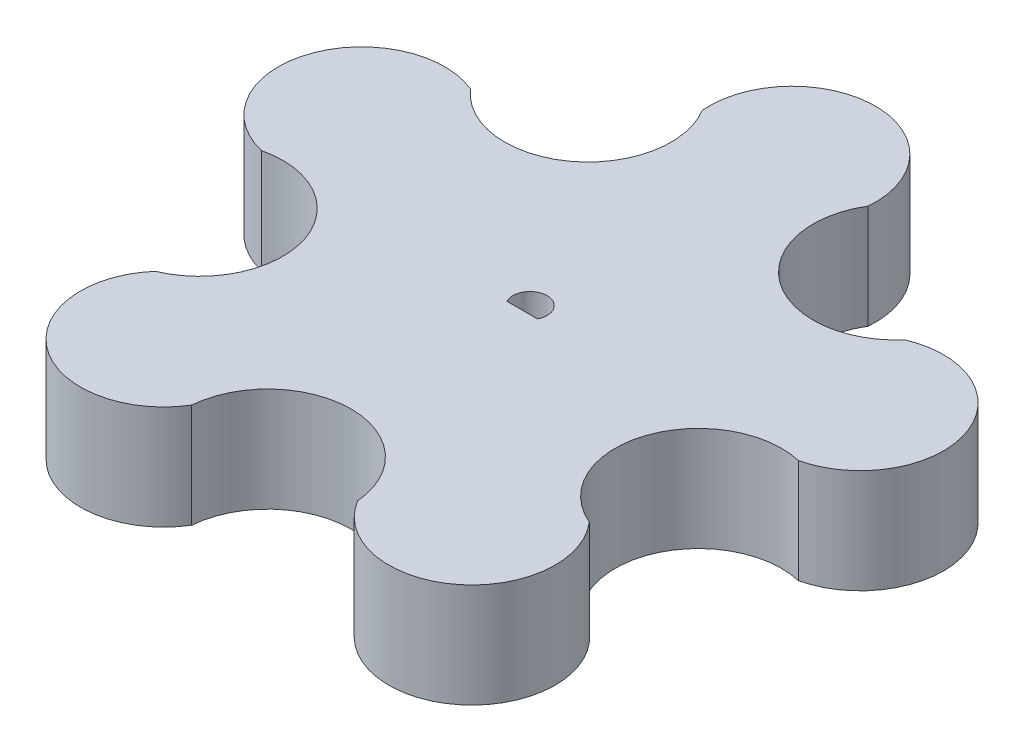
ISO-10303-21;
HEADER;
FILE_DESCRIPTION(('STEP AP214'),'2;1');
FILE_NAME('part.step','',(''),(''),'','','');
FILE_SCHEMA(('AUTOMOTIVE_DESIGN { 1 0 10303 214 1 1 1 1 }'));
ENDSEC;
DATA;
#1=APPLICATION_CONTEXT('core data for automotive mechanical design processes');
#2=APPLICATION_PROTOCOL_DEFINITION('international standard','automotive_design',2000,#1);
#3=PRODUCT_CONTEXT('',#1,'mechanical');
#4=PRODUCT('Part','Part','',(#3));
#5=PRODUCT_RELATED_PRODUCT_CATEGORY('part','',(#4));
#6=PRODUCT_DEFINITION_FORMATION('','',#4);
#7=PRODUCT_DEFINITION_CONTEXT('part definition',#1,'design');
#8=PRODUCT_DEFINITION('design','',#6,#7);
#9=PRODUCT_DEFINITION_SHAPE('','',#8);
#10=(LENGTH_UNIT() NAMED_UNIT(*) SI_UNIT(.MILLI.,.METRE.));
#11=(NAMED_UNIT(*) PLANE_ANGLE_UNIT() SI_UNIT($,.RADIAN.));
#12=(NAMED_UNIT(*) SI_UNIT($,.STERADIAN.) SOLID_ANGLE_UNIT());
#13=UNCERTAINTY_MEASURE_WITH_UNIT(LENGTH_MEASURE(1.E-05),#10,'distance_accuracy_value','');
#14=(GEOMETRIC_REPRESENTATION_CONTEXT(3) GLOBAL_UNCERTAINTY_ASSIGNED_CONTEXT((#13)) GLOBAL_UNIT_ASSIGNED_CONTEXT((#10,
#11,#12)) REPRESENTATION_CONTEXT('',''));
#15=CARTESIAN_POINT('',(0.,0.,0.));
#16=DIRECTION('',(0.,0.,1.));
#17=DIRECTION('',(1.,0.,0.));
#18=AXIS2_PLACEMENT_3D('',#15,#16,#17);
#19=CARTESIAN_POINT('',(54.0246968609837,6.35,-29.1758126987164));
#20=DIRECTION('',(0.,1.,0.));
#21=DIRECTION('',(0.,0.,1.));
#22=AXIS2_PLACEMENT_3D('',#19,#20,#21);
#23=PLANE('',#22);
#24=CARTESIAN_POINT('',(49.3218270573917,6.35,-27.6477576707104));
#25=DIRECTION('',(0.,-1.,0.));
#26=DIRECTION('',(0.,0.,1.));
#27=AXIS2_PLACEMENT_3D('',#24,#25,#26);
#28=CIRCLE('',#27,5.07999999999999);
#29=CARTESIAN_POINT('',(53.6650585015633,6.35,-30.2826657568414));
#30=VERTEX_POINT('',#29);
#31=CARTESIAN_POINT('',(45.4737482254853,6.35,-24.3313304811834));
#32=VERTEX_POINT('',#31);
#33=EDGE_CURVE('E138',#30,#32,#28,.T.);
#34=ORIENTED_EDGE('',*,*,#33,.T.);
#35=CARTESIAN_POINT('',(43.5087602908208,6.35,-19.6467576707104));
#36=DIRECTION('',(0.,1.,0.));
#37=DIRECTION('',(0.,0.,1.));
#38=AXIS2_PLACEMENT_3D('',#35,#36,#37);
#39=CIRCLE('',#38,5.07999999999999);
#40=CARTESIAN_POINT('',(42.3449461124198,6.35,-14.7018677267225));
#41=VERTEX_POINT('',#40);
#42=EDGE_CURVE('E141',#32,#41,#39,.T.);
#43=ORIENTED_EDGE('',*,*,#42,.T.);
#44=CARTESIAN_POINT('',(43.5087602908208,6.35,-9.75697778273456));
#45=DIRECTION('',(0.,-1.,0.));
#46=DIRECTION('',(0.,0.,1.));
#47=AXIS2_PLACEMENT_3D('',#44,#45,#46);
#48=CIRCLE('',#47,5.07999999999999);
#49=CARTESIAN_POINT('',(45.4737482254853,6.35,-5.07240497226158));
#50=VERTEX_POINT('',#49);
#51=EDGE_CURVE('E144',#41,#50,#48,.T.);
#52=ORIENTED_EDGE('',*,*,#51,.T.);
#53=CARTESIAN_POINT('',(49.3218270573916,6.35,-1.75597778273456));
#54=DIRECTION('',(0.,1.,0.));
#55=DIRECTION('',(0.,0.,1.));
#56=AXIS2_PLACEMENT_3D('',#53,#54,#55);
#57=CIRCLE('',#56,5.07999999999999);
#58=CARTESIAN_POINT('',(53.6650585015633,6.35,0.878930303396379));
#59=VERTEX_POINT('',#58);
#60=EDGE_CURVE('E146',#50,#59,#57,.T.);
#61=ORIENTED_EDGE('',*,*,#60,.T.);
#62=CARTESIAN_POINT('',(58.7275666645758,6.35,1.30013227327753));
#63=DIRECTION('',(0.,-1.,0.));
#64=DIRECTION('',(0.,0.,1.));
#65=AXIS2_PLACEMENT_3D('',#62,#63,#64);
#66=CIRCLE('',#65,5.07999999999999);
#67=CARTESIAN_POINT('',(63.7900748275883,6.35,0.878930303396409));
#68=VERTEX_POINT('',#67);
#69=EDGE_CURVE('E148',#59,#68,#66,.T.);
#70=ORIENTED_EDGE('',*,*,#69,.T.);
#71=CARTESIAN_POINT('',(68.13330627176,6.35,-1.75597778273456));
#72=DIRECTION('',(0.,1.,0.));
#73=DIRECTION('',(0.,0.,1.));
#74=AXIS2_PLACEMENT_3D('',#71,#72,#73);
#75=CIRCLE('',#74,5.07999999999999);
#76=CARTESIAN_POINT('',(71.9813851036663,6.35,-5.07240497226161));
#77=VERTEX_POINT('',#76);
#78=EDGE_CURVE('E150',#68,#77,#75,.T.);
#79=ORIENTED_EDGE('',*,*,#78,.T.);
#80=CARTESIAN_POINT('',(73.9463730383309,6.35,-9.75697778273458));
#81=DIRECTION('',(0.,-1.,0.));
#82=DIRECTION('',(0.,0.,1.));
#83=AXIS2_PLACEMENT_3D('',#80,#81,#82);
#84=CIRCLE('',#83,5.07999999999999);
#85=CARTESIAN_POINT('',(75.1101872167319,6.35,-14.7018677267225));
#86=VERTEX_POINT('',#85);
#87=EDGE_CURVE('E152',#77,#86,#84,.T.);
#88=ORIENTED_EDGE('',*,*,#87,.T.);
#89=CARTESIAN_POINT('',(73.9463730383309,6.35,-19.6467576707104));
#90=DIRECTION('',(0.,1.,0.));
#91=DIRECTION('',(0.,0.,1.));
#92=AXIS2_PLACEMENT_3D('',#89,#90,#91);
#93=CIRCLE('',#92,5.07999999999999);
#94=CARTESIAN_POINT('',(71.9813851036663,6.35,-24.3313304811833));
#95=VERTEX_POINT('',#94);
#96=EDGE_CURVE('E154',#86,#95,#93,.T.);
#97=ORIENTED_EDGE('',*,*,#96,.T.);
#98=CARTESIAN_POINT('',(68.13330627176,6.35,-27.6477576707104));
#99=DIRECTION('',(0.,-1.,0.));
#100=DIRECTION('',(0.,0.,1.));
#101=AXIS2_PLACEMENT_3D('',#98,#99,#100);
#102=CIRCLE('',#101,5.07999999999999);
#103=CARTESIAN_POINT('',(63.7900748275883,6.35,-30.2826657568414));
#104=VERTEX_POINT('',#103);
#105=EDGE_CURVE('E156',#95,#104,#102,.T.);
#106=ORIENTED_EDGE('',*,*,#105,.T.);
#107=CARTESIAN_POINT('',(58.7275666645758,6.35,-30.7038677267225));
#108=DIRECTION('',(0.,1.,0.));
#109=DIRECTION('',(0.,0.,1.));
#110=AXIS2_PLACEMENT_3D('',#107,#108,#109);
#111=CIRCLE('',#110,5.07999999999999);
#112=EDGE_CURVE('E158',#104,#30,#111,.T.);
#113=ORIENTED_EDGE('',*,*,#112,.T.);
#114=EDGE_LOOP('',(#34,#43,#52,#61,#70,#79,#88,#97,#106,#113));
#115=FACE_BOUND('',#114,.T.);
#116=DIRECTION('',(1.,0.,0.));
#117=VECTOR('',#116,1.);
#118=CARTESIAN_POINT('',(57.7943110725754,6.35,-14.2256177267225));
#119=LINE('',#118,#117);
#120=CARTESIAN_POINT('',(57.7943110725754,6.35,-14.2256177267225));
#121=VERTEX_POINT('',#120);
#122=CARTESIAN_POINT('',(59.6608222565762,6.35,-14.2256177267225));
#123=VERTEX_POINT('',#122);
#124=EDGE_CURVE('E121',#121,#123,#119,.T.);
#125=ORIENTED_EDGE('',*,*,#124,.F.);
#126=CARTESIAN_POINT('',(58.7275666645758,6.35,-14.7018677267225));
#127=DIRECTION('',(0.,1.,0.));
#128=DIRECTION('',(0.,0.,1.));
#129=AXIS2_PLACEMENT_3D('',#126,#127,#128);
#130=CIRCLE('',#129,1.04775);
#131=EDGE_CURVE('E127',#123,#121,#130,.T.);
#132=ORIENTED_EDGE('',*,*,#131,.F.);
#133=EDGE_LOOP('',(#125,#132));
#134=FACE_BOUND('',#133,.T.);
#135=ADVANCED_FACE('F33',(#115,#134),#23,.T.);
#136=CARTESIAN_POINT('',(54.0246968609837,0.,-29.1758126987164));
#137=DIRECTION('',(0.,1.,0.));
#138=DIRECTION('',(0.,0.,1.));
#139=AXIS2_PLACEMENT_3D('',#136,#137,#138);
#140=PLANE('',#139);
#141=CARTESIAN_POINT('',(49.3218270573917,0.,-27.6477576707104));
#142=DIRECTION('',(0.,-1.,0.));
#143=DIRECTION('',(0.,0.,1.));
#144=AXIS2_PLACEMENT_3D('',#141,#142,#143);
#145=CIRCLE('',#144,5.07999999999999);
#146=CARTESIAN_POINT('',(53.6650585015633,0.,-30.2826657568414));
#147=VERTEX_POINT('',#146);
#148=CARTESIAN_POINT('',(45.4737482254853,0.,-24.3313304811834));
#149=VERTEX_POINT('',#148);
#150=EDGE_CURVE('E137',#147,#149,#145,.T.);
#151=ORIENTED_EDGE('',*,*,#150,.F.);
#152=CARTESIAN_POINT('',(58.7275666645758,0.,-30.7038677267225));
#153=DIRECTION('',(0.,1.,0.));
#154=DIRECTION('',(0.,0.,1.));
#155=AXIS2_PLACEMENT_3D('',#152,#153,#154);
#156=CIRCLE('',#155,5.07999999999999);
#157=CARTESIAN_POINT('',(63.7900748275883,0.,-30.2826657568414));
#158=VERTEX_POINT('',#157);
#159=EDGE_CURVE('E142',#158,#147,#156,.T.);
#160=ORIENTED_EDGE('',*,*,#159,.F.);
#161=CARTESIAN_POINT('',(68.13330627176,0.,-27.6477576707104));
#162=DIRECTION('',(0.,-1.,0.));
#163=DIRECTION('',(0.,0.,1.));
#164=AXIS2_PLACEMENT_3D('',#161,#162,#163);
#165=CIRCLE('',#164,5.07999999999999);
#166=CARTESIAN_POINT('',(71.9813851036663,0.,-24.3313304811833));
#167=VERTEX_POINT('',#166);
#168=EDGE_CURVE('E177',#167,#158,#165,.T.);
#169=ORIENTED_EDGE('',*,*,#168,.F.);
#170=CARTESIAN_POINT('',(73.9463730383309,0.,-19.6467576707104));
#171=DIRECTION('',(0.,1.,0.));
#172=DIRECTION('',(0.,0.,1.));
#173=AXIS2_PLACEMENT_3D('',#170,#171,#172);
#174=CIRCLE('',#173,5.07999999999999);
#175=CARTESIAN_POINT('',(75.1101872167319,0.,-14.7018677267225));
#176=VERTEX_POINT('',#175);
#177=EDGE_CURVE('E175',#176,#167,#174,.T.);
#178=ORIENTED_EDGE('',*,*,#177,.F.);
#179=CARTESIAN_POINT('',(73.9463730383309,0.,-9.75697778273458));
#180=DIRECTION('',(0.,-1.,0.));
#181=DIRECTION('',(0.,0.,1.));
#182=AXIS2_PLACEMENT_3D('',#179,#180,#181);
#183=CIRCLE('',#182,5.07999999999999);
#184=CARTESIAN_POINT('',(71.9813851036663,0.,-5.07240497226161));
#185=VERTEX_POINT('',#184);
#186=EDGE_CURVE('E173',#185,#176,#183,.T.);
#187=ORIENTED_EDGE('',*,*,#186,.F.);
#188=CARTESIAN_POINT('',(68.13330627176,0.,-1.75597778273456));
#189=DIRECTION('',(0.,1.,0.));
#190=DIRECTION('',(0.,0.,1.));
#191=AXIS2_PLACEMENT_3D('',#188,#189,#190);
#192=CIRCLE('',#191,5.07999999999999);
#193=CARTESIAN_POINT('',(63.7900748275883,0.,0.878930303396409));
#194=VERTEX_POINT('',#193);
#195=EDGE_CURVE('E171',#194,#185,#192,.T.);
#196=ORIENTED_EDGE('',*,*,#195,.F.);
#197=CARTESIAN_POINT('',(58.7275666645758,0.,1.30013227327753));
#198=DIRECTION('',(0.,-1.,0.));
#199=DIRECTION('',(0.,0.,1.));
#200=AXIS2_PLACEMENT_3D('',#197,#198,#199);
#201=CIRCLE('',#200,5.07999999999999);
#202=CARTESIAN_POINT('',(53.6650585015633,0.,0.878930303396379));
#203=VERTEX_POINT('',#202);
#204=EDGE_CURVE('E169',#203,#194,#201,.T.);
#205=ORIENTED_EDGE('',*,*,#204,.F.);
#206=CARTESIAN_POINT('',(49.3218270573916,0.,-1.75597778273456));
#207=DIRECTION('',(0.,1.,0.));
#208=DIRECTION('',(0.,0.,1.));
#209=AXIS2_PLACEMENT_3D('',#206,#207,#208);
#210=CIRCLE('',#209,5.07999999999999);
#211=CARTESIAN_POINT('',(45.4737482254853,0.,-5.07240497226158));
#212=VERTEX_POINT('',#211);
#213=EDGE_CURVE('E167',#212,#203,#210,.T.);
#214=ORIENTED_EDGE('',*,*,#213,.F.);
#215=CARTESIAN_POINT('',(43.5087602908208,0.,-9.75697778273456));
#216=DIRECTION('',(0.,-1.,0.));
#217=DIRECTION('',(0.,0.,1.));
#218=AXIS2_PLACEMENT_3D('',#215,#216,#217);
#219=CIRCLE('',#218,5.07999999999999);
#220=CARTESIAN_POINT('',(42.3449461124198,0.,-14.7018677267225));
#221=VERTEX_POINT('',#220);
#222=EDGE_CURVE('E165',#221,#212,#219,.T.);
#223=ORIENTED_EDGE('',*,*,#222,.F.);
#224=CARTESIAN_POINT('',(43.5087602908208,0.,-19.6467576707104));
#225=DIRECTION('',(0.,1.,0.));
#226=DIRECTION('',(0.,0.,1.));
#227=AXIS2_PLACEMENT_3D('',#224,#225,#226);
#228=CIRCLE('',#227,5.07999999999999);
#229=EDGE_CURVE('E163',#149,#221,#228,.T.);
#230=ORIENTED_EDGE('',*,*,#229,.F.);
#231=EDGE_LOOP('',(#151,#160,#169,#178,#187,#196,#205,#214,#223,#230));
#232=FACE_BOUND('',#231,.T.);
#233=CARTESIAN_POINT('',(58.7275666645758,0.,-14.7018677267225));
#234=DIRECTION('',(0.,1.,0.));
#235=DIRECTION('',(0.,0.,1.));
#236=AXIS2_PLACEMENT_3D('',#233,#234,#235);
#237=CIRCLE('',#236,1.04775);
#238=CARTESIAN_POINT('',(59.6608222565762,0.,-14.2256177267225));
#239=VERTEX_POINT('',#238);
#240=CARTESIAN_POINT('',(57.7943110725754,0.,-14.2256177267225));
#241=VERTEX_POINT('',#240);
#242=EDGE_CURVE('E55',#239,#241,#237,.T.);
#243=ORIENTED_EDGE('',*,*,#242,.T.);
#244=DIRECTION('',(1.,0.,0.));
#245=VECTOR('',#244,1.);
#246=CARTESIAN_POINT('',(57.7943110725754,0.,-14.2256177267225));
#247=LINE('',#246,#245);
#248=EDGE_CURVE('E131',#241,#239,#247,.T.);
#249=ORIENTED_EDGE('',*,*,#248,.T.);
#250=EDGE_LOOP('',(#243,#249));
#251=FACE_BOUND('',#250,.T.);
#252=ADVANCED_FACE('F213',(#232,#251),#140,.F.);
#253=CARTESIAN_POINT('',(49.3218270573917,6.35,-27.6477576707104));
#254=DIRECTION('',(0.,-1.,0.));
#255=DIRECTION('',(0.,0.,-1.));
#256=AXIS2_PLACEMENT_3D('',#253,#254,#255);
#257=CYLINDRICAL_SURFACE('',#256,5.07999999999999);
#258=ORIENTED_EDGE('',*,*,#150,.T.);
#259=DIRECTION('',(0.,-1.,0.));
#260=VECTOR('',#259,1.);
#261=CARTESIAN_POINT('',(45.4737482254853,6.35,-24.3313304811834));
#262=LINE('',#261,#260);
#263=EDGE_CURVE('E11',#32,#149,#262,.T.);
#264=ORIENTED_EDGE('',*,*,#263,.F.);
#265=ORIENTED_EDGE('',*,*,#33,.F.);
#266=DIRECTION('',(0.,-1.,0.));
#267=VECTOR('',#266,1.);
#268=CARTESIAN_POINT('',(53.6650585015633,6.35,-30.2826657568414));
#269=LINE('',#268,#267);
#270=EDGE_CURVE('E160',#30,#147,#269,.T.);
#271=ORIENTED_EDGE('',*,*,#270,.T.);
#272=EDGE_LOOP('',(#258,#264,#265,#271));
#273=FACE_BOUND('',#272,.T.);
#274=ADVANCED_FACE('F35',(#273),#257,.F.);
#275=CARTESIAN_POINT('',(43.5087602908208,6.35,-19.6467576707104));
#276=DIRECTION('',(0.,-1.,0.));
#277=DIRECTION('',(0.,0.,-1.));
#278=AXIS2_PLACEMENT_3D('',#275,#276,#277);
#279=CYLINDRICAL_SURFACE('',#278,5.07999999999999);
#280=ORIENTED_EDGE('',*,*,#229,.T.);
#281=DIRECTION('',(0.,-1.,0.));
#282=VECTOR('',#281,1.);
#283=CARTESIAN_POINT('',(42.3449461124198,6.35,-14.7018677267225));
#284=LINE('',#283,#282);
#285=EDGE_CURVE('E41',#41,#221,#284,.T.);
#286=ORIENTED_EDGE('',*,*,#285,.F.);
#287=ORIENTED_EDGE('',*,*,#42,.F.);
#288=ORIENTED_EDGE('',*,*,#263,.T.);
#289=EDGE_LOOP('',(#280,#286,#287,#288));
#290=FACE_BOUND('',#289,.T.);
#291=ADVANCED_FACE('F230',(#290),#279,.T.);
#292=CARTESIAN_POINT('',(43.5087602908208,6.35,-9.75697778273456));
#293=DIRECTION('',(0.,-1.,0.));
#294=DIRECTION('',(0.,0.,-1.));
#295=AXIS2_PLACEMENT_3D('',#292,#293,#294);
#296=CYLINDRICAL_SURFACE('',#295,5.07999999999999);
#297=ORIENTED_EDGE('',*,*,#222,.T.);
#298=DIRECTION('',(0.,-1.,0.));
#299=VECTOR('',#298,1.);
#300=CARTESIAN_POINT('',(45.4737482254853,6.35,-5.07240497226158));
#301=LINE('',#300,#299);
#302=EDGE_CURVE('E200',#50,#212,#301,.T.);
#303=ORIENTED_EDGE('',*,*,#302,.F.);
#304=ORIENTED_EDGE('',*,*,#51,.F.);
#305=ORIENTED_EDGE('',*,*,#285,.T.);
#306=EDGE_LOOP('',(#297,#303,#304,#305));
#307=FACE_BOUND('',#306,.T.);
#308=ADVANCED_FACE('F207',(#307),#296,.F.);
#309=CARTESIAN_POINT('',(49.3218270573916,6.35,-1.75597778273456));
#310=DIRECTION('',(0.,-1.,0.));
#311=DIRECTION('',(0.,0.,-1.));
#312=AXIS2_PLACEMENT_3D('',#309,#310,#311);
#313=CYLINDRICAL_SURFACE('',#312,5.07999999999999);
#314=ORIENTED_EDGE('',*,*,#213,.T.);
#315=DIRECTION('',(0.,-1.,0.));
#316=VECTOR('',#315,1.);
#317=CARTESIAN_POINT('',(53.6650585015633,6.35,0.878930303396379));
#318=LINE('',#317,#316);
#319=EDGE_CURVE('E197',#59,#203,#318,.T.);
#320=ORIENTED_EDGE('',*,*,#319,.F.);
#321=ORIENTED_EDGE('',*,*,#60,.F.);
#322=ORIENTED_EDGE('',*,*,#302,.T.);
#323=EDGE_LOOP('',(#314,#320,#321,#322));
#324=FACE_BOUND('',#323,.T.);
#325=ADVANCED_FACE('F219',(#324),#313,.T.);
#326=CARTESIAN_POINT('',(58.7275666645758,6.35,1.30013227327753));
#327=DIRECTION('',(0.,-1.,0.));
#328=DIRECTION('',(0.,0.,-1.));
#329=AXIS2_PLACEMENT_3D('',#326,#327,#328);
#330=CYLINDRICAL_SURFACE('',#329,5.07999999999999);
#331=ORIENTED_EDGE('',*,*,#204,.T.);
#332=DIRECTION('',(0.,-1.,0.));
#333=VECTOR('',#332,1.);
#334=CARTESIAN_POINT('',(63.7900748275883,6.35,0.878930303396409));
#335=LINE('',#334,#333);
#336=EDGE_CURVE('E194',#68,#194,#335,.T.);
#337=ORIENTED_EDGE('',*,*,#336,.F.);
#338=ORIENTED_EDGE('',*,*,#69,.F.);
#339=ORIENTED_EDGE('',*,*,#319,.T.);
#340=EDGE_LOOP('',(#331,#337,#338,#339));
#341=FACE_BOUND('',#340,.T.);
#342=ADVANCED_FACE('F223',(#341),#330,.F.);
#343=CARTESIAN_POINT('',(68.13330627176,6.35,-1.75597778273456));
#344=DIRECTION('',(0.,-1.,0.));
#345=DIRECTION('',(0.,0.,-1.));
#346=AXIS2_PLACEMENT_3D('',#343,#344,#345);
#347=CYLINDRICAL_SURFACE('',#346,5.07999999999999);
#348=ORIENTED_EDGE('',*,*,#195,.T.);
#349=DIRECTION('',(0.,-1.,0.));
#350=VECTOR('',#349,1.);
#351=CARTESIAN_POINT('',(71.9813851036663,6.35,-5.07240497226161));
#352=LINE('',#351,#350);
#353=EDGE_CURVE('E191',#77,#185,#352,.T.);
#354=ORIENTED_EDGE('',*,*,#353,.F.);
#355=ORIENTED_EDGE('',*,*,#78,.F.);
#356=ORIENTED_EDGE('',*,*,#336,.T.);
#357=EDGE_LOOP('',(#348,#354,#355,#356));
#358=FACE_BOUND('',#357,.T.);
#359=ADVANCED_FACE('F253',(#358),#347,.T.);
#360=CARTESIAN_POINT('',(73.9463730383309,6.35,-9.75697778273458));
#361=DIRECTION('',(0.,-1.,0.));
#362=DIRECTION('',(0.,0.,-1.));
#363=AXIS2_PLACEMENT_3D('',#360,#361,#362);
#364=CYLINDRICAL_SURFACE('',#363,5.07999999999999);
#365=ORIENTED_EDGE('',*,*,#186,.T.);
#366=DIRECTION('',(0.,-1.,0.));
#367=VECTOR('',#366,1.);
#368=CARTESIAN_POINT('',(75.1101872167319,6.35,-14.7018677267225));
#369=LINE('',#368,#367);
#370=EDGE_CURVE('E188',#86,#176,#369,.T.);
#371=ORIENTED_EDGE('',*,*,#370,.F.);
#372=ORIENTED_EDGE('',*,*,#87,.F.);
#373=ORIENTED_EDGE('',*,*,#353,.T.);
#374=EDGE_LOOP('',(#365,#371,#372,#373));
#375=FACE_BOUND('',#374,.T.);
#376=ADVANCED_FACE('F250',(#375),#364,.F.);
#377=CARTESIAN_POINT('',(73.9463730383309,6.35,-19.6467576707104));
#378=DIRECTION('',(0.,-1.,0.));
#379=DIRECTION('',(0.,0.,-1.));
#380=AXIS2_PLACEMENT_3D('',#377,#378,#379);
#381=CYLINDRICAL_SURFACE('',#380,5.07999999999999);
#382=ORIENTED_EDGE('',*,*,#177,.T.);
#383=DIRECTION('',(0.,-1.,0.));
#384=VECTOR('',#383,1.);
#385=CARTESIAN_POINT('',(71.9813851036663,6.35,-24.3313304811833));
#386=LINE('',#385,#384);
#387=EDGE_CURVE('E185',#95,#167,#386,.T.);
#388=ORIENTED_EDGE('',*,*,#387,.F.);
#389=ORIENTED_EDGE('',*,*,#96,.F.);
#390=ORIENTED_EDGE('',*,*,#370,.T.);
#391=EDGE_LOOP('',(#382,#388,#389,#390));
#392=FACE_BOUND('',#391,.T.);
#393=ADVANCED_FACE('F246',(#392),#381,.T.);
#394=CARTESIAN_POINT('',(68.13330627176,6.35,-27.6477576707104));
#395=DIRECTION('',(0.,-1.,0.));
#396=DIRECTION('',(0.,0.,-1.));
#397=AXIS2_PLACEMENT_3D('',#394,#395,#396);
#398=CYLINDRICAL_SURFACE('',#397,5.07999999999999);
#399=ORIENTED_EDGE('',*,*,#168,.T.);
#400=DIRECTION('',(0.,-1.,0.));
#401=VECTOR('',#400,1.);
#402=CARTESIAN_POINT('',(63.7900748275883,6.35,-30.2826657568414));
#403=LINE('',#402,#401);
#404=EDGE_CURVE('E182',#104,#158,#403,.T.);
#405=ORIENTED_EDGE('',*,*,#404,.F.);
#406=ORIENTED_EDGE('',*,*,#105,.F.);
#407=ORIENTED_EDGE('',*,*,#387,.T.);
#408=EDGE_LOOP('',(#399,#405,#406,#407));
#409=FACE_BOUND('',#408,.T.);
#410=ADVANCED_FACE('F242',(#409),#398,.F.);
#411=CARTESIAN_POINT('',(58.7275666645758,6.35,-30.7038677267225));
#412=DIRECTION('',(0.,-1.,0.));
#413=DIRECTION('',(0.,0.,-1.));
#414=AXIS2_PLACEMENT_3D('',#411,#412,#413);
#415=CYLINDRICAL_SURFACE('',#414,5.07999999999999);
#416=ORIENTED_EDGE('',*,*,#159,.T.);
#417=ORIENTED_EDGE('',*,*,#270,.F.);
#418=ORIENTED_EDGE('',*,*,#112,.F.);
#419=ORIENTED_EDGE('',*,*,#404,.T.);
#420=EDGE_LOOP('',(#416,#417,#418,#419));
#421=FACE_BOUND('',#420,.T.);
#422=ADVANCED_FACE('F237',(#421),#415,.T.);
#423=CARTESIAN_POINT('',(58.7275666645758,6.35,-14.7018677267225));
#424=DIRECTION('',(0.,-1.,0.));
#425=DIRECTION('',(0.,0.,-1.));
#426=AXIS2_PLACEMENT_3D('',#423,#424,#425);
#427=CYLINDRICAL_SURFACE('',#426,1.04775);
#428=ORIENTED_EDGE('',*,*,#242,.F.);
#429=DIRECTION('',(0.,-1.,0.));
#430=VECTOR('',#429,1.);
#431=CARTESIAN_POINT('',(59.6608222565762,6.35,-14.2256177267225));
#432=LINE('',#431,#430);
#433=EDGE_CURVE('E123',#123,#239,#432,.T.);
#434=ORIENTED_EDGE('',*,*,#433,.F.);
#435=ORIENTED_EDGE('',*,*,#131,.T.);
#436=DIRECTION('',(0.,-1.,0.));
#437=VECTOR('',#436,1.);
#438=CARTESIAN_POINT('',(57.7943110725754,6.35,-14.2256177267225));
#439=LINE('',#438,#437);
#440=EDGE_CURVE('E48',#121,#241,#439,.T.);
#441=ORIENTED_EDGE('',*,*,#440,.T.);
#442=EDGE_LOOP('',(#428,#434,#435,#441));
#443=FACE_BOUND('',#442,.T.);
#444=ADVANCED_FACE('F129',(#443),#427,.F.);
#445=CARTESIAN_POINT('',(57.7943110725754,6.35,-14.2256177267225));
#446=DIRECTION('',(0.,0.,-1.));
#447=DIRECTION('',(-1.,0.,0.));
#448=AXIS2_PLACEMENT_3D('',#445,#446,#447);
#449=PLANE('',#448);
#450=ORIENTED_EDGE('',*,*,#248,.F.);
#451=ORIENTED_EDGE('',*,*,#440,.F.);
#452=ORIENTED_EDGE('',*,*,#124,.T.);
#453=ORIENTED_EDGE('',*,*,#433,.T.);
#454=EDGE_LOOP('',(#450,#451,#452,#453));
#455=FACE_BOUND('',#454,.T.);
#456=ADVANCED_FACE('F122',(#455),#449,.T.);
#457=CLOSED_SHELL('',(#135,#252,#274,#291,#308,#325,#342,#359,#376,#393,#410,#422,#444,#456));
#458=MANIFOLD_SOLID_BREP('B2',#457);
#459=ADVANCED_BREP_SHAPE_REPRESENTATION('',(#18,#458),#14);
#460=SHAPE_DEFINITION_REPRESENTATION(#9,#459);
ENDSEC;
END-ISO-10303-21;
